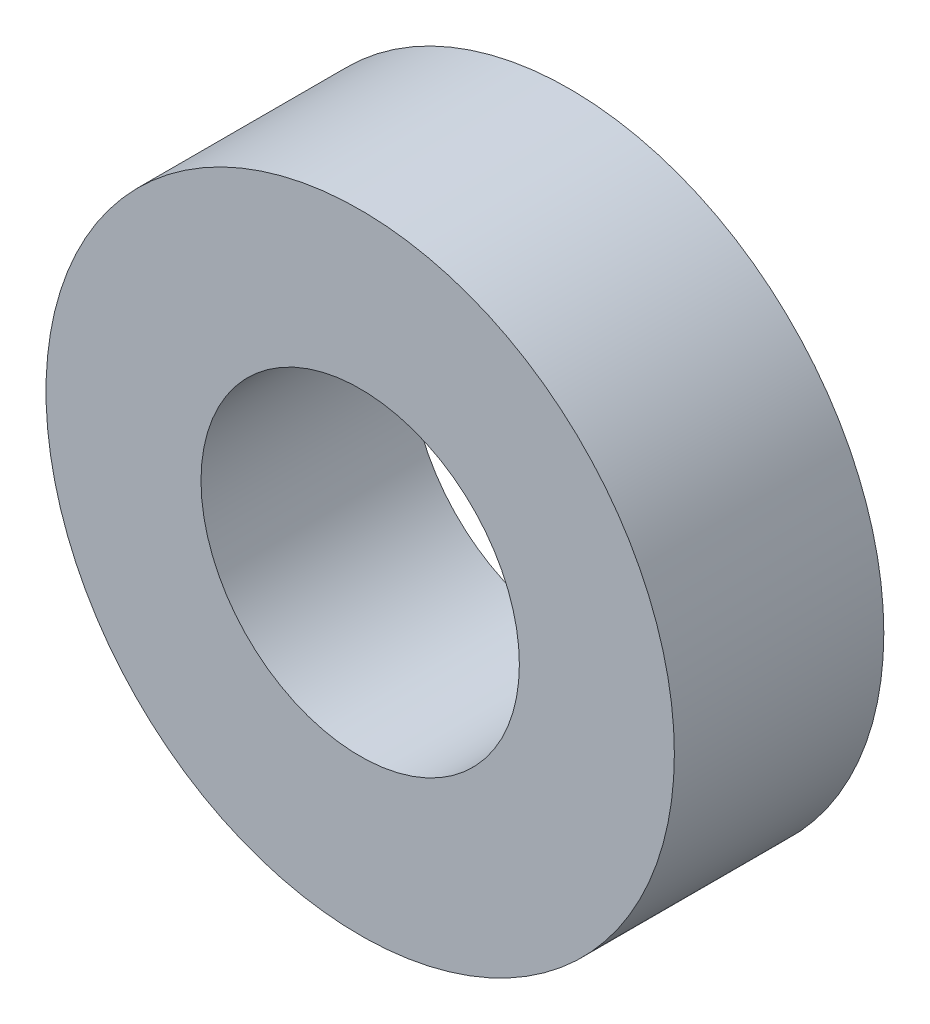
ISO-10303-21;
HEADER;
FILE_DESCRIPTION(('STEP AP214'),'2;1');
FILE_NAME('part.step','',(''),(''),'','','');
FILE_SCHEMA(('AUTOMOTIVE_DESIGN { 1 0 10303 214 1 1 1 1 }'));
ENDSEC;
DATA;
#1=APPLICATION_CONTEXT('core data for automotive mechanical design processes');
#2=APPLICATION_PROTOCOL_DEFINITION('international standard','automotive_design',2000,#1);
#3=PRODUCT_CONTEXT('',#1,'mechanical');
#4=PRODUCT('Part','Part','',(#3));
#5=PRODUCT_RELATED_PRODUCT_CATEGORY('part','',(#4));
#6=PRODUCT_DEFINITION_FORMATION('','',#4);
#7=PRODUCT_DEFINITION_CONTEXT('part definition',#1,'design');
#8=PRODUCT_DEFINITION('design','',#6,#7);
#9=PRODUCT_DEFINITION_SHAPE('','',#8);
#10=(LENGTH_UNIT() NAMED_UNIT(*) SI_UNIT(.MILLI.,.METRE.));
#11=(NAMED_UNIT(*) PLANE_ANGLE_UNIT() SI_UNIT($,.RADIAN.));
#12=(NAMED_UNIT(*) SI_UNIT($,.STERADIAN.) SOLID_ANGLE_UNIT());
#13=UNCERTAINTY_MEASURE_WITH_UNIT(LENGTH_MEASURE(1.E-05),#10,'distance_accuracy_value','');
#14=(GEOMETRIC_REPRESENTATION_CONTEXT(3) GLOBAL_UNCERTAINTY_ASSIGNED_CONTEXT((#13)) GLOBAL_UNIT_ASSIGNED_CONTEXT((#10,
#11,#12)) REPRESENTATION_CONTEXT('',''));
#15=CARTESIAN_POINT('',(0.,0.,0.));
#16=DIRECTION('',(0.,0.,1.));
#17=DIRECTION('',(1.,0.,0.));
#18=AXIS2_PLACEMENT_3D('',#15,#16,#17);
#19=CARTESIAN_POINT('',(0.,0.,3.175));
#20=DIRECTION('',(0.,0.,1.));
#21=DIRECTION('',(1.,0.,0.));
#22=AXIS2_PLACEMENT_3D('',#19,#20,#21);
#23=PLANE('',#22);
#24=CARTESIAN_POINT('',(0.,0.,3.175));
#25=DIRECTION('',(0.,0.,1.));
#26=DIRECTION('',(1.,0.,0.));
#27=AXIS2_PLACEMENT_3D('',#24,#25,#26);
#28=CIRCLE('',#27,9.525);
#29=CARTESIAN_POINT('',(9.525,0.,3.175));
#30=VERTEX_POINT('',#29);
#31=EDGE_CURVE('E10',#30,#30,#28,.T.);
#32=ORIENTED_EDGE('',*,*,#31,.T.);
#33=EDGE_LOOP('',(#32));
#34=FACE_BOUND('',#33,.T.);
#35=CARTESIAN_POINT('',(0.,0.,3.175));
#36=DIRECTION('',(0.,0.,1.));
#37=DIRECTION('',(1.,0.,0.));
#38=AXIS2_PLACEMENT_3D('',#35,#36,#37);
#39=CIRCLE('',#38,4.826);
#40=CARTESIAN_POINT('',(4.826,0.,3.175));
#41=VERTEX_POINT('',#40);
#42=EDGE_CURVE('E41',#41,#41,#39,.T.);
#43=ORIENTED_EDGE('',*,*,#42,.F.);
#44=EDGE_LOOP('',(#43));
#45=FACE_BOUND('',#44,.T.);
#46=ADVANCED_FACE('F30',(#34,#45),#23,.T.);
#47=CARTESIAN_POINT('',(0.,0.,-3.175));
#48=DIRECTION('',(0.,0.,1.));
#49=DIRECTION('',(1.,0.,0.));
#50=AXIS2_PLACEMENT_3D('',#47,#48,#49);
#51=PLANE('',#50);
#52=CARTESIAN_POINT('',(0.,0.,-3.175));
#53=DIRECTION('',(0.,0.,1.));
#54=DIRECTION('',(1.,0.,0.));
#55=AXIS2_PLACEMENT_3D('',#52,#53,#54);
#56=CIRCLE('',#55,9.525);
#57=CARTESIAN_POINT('',(9.525,0.,-3.175));
#58=VERTEX_POINT('',#57);
#59=EDGE_CURVE('E34',#58,#58,#56,.T.);
#60=ORIENTED_EDGE('',*,*,#59,.F.);
#61=EDGE_LOOP('',(#60));
#62=FACE_BOUND('',#61,.T.);
#63=CARTESIAN_POINT('',(0.,0.,-3.175));
#64=DIRECTION('',(0.,0.,1.));
#65=DIRECTION('',(1.,0.,0.));
#66=AXIS2_PLACEMENT_3D('',#63,#64,#65);
#67=CIRCLE('',#66,4.826);
#68=CARTESIAN_POINT('',(4.826,0.,-3.175));
#69=VERTEX_POINT('',#68);
#70=EDGE_CURVE('E43',#69,#69,#67,.T.);
#71=ORIENTED_EDGE('',*,*,#70,.T.);
#72=EDGE_LOOP('',(#71));
#73=FACE_BOUND('',#72,.T.);
#74=ADVANCED_FACE('F53',(#62,#73),#51,.F.);
#75=CARTESIAN_POINT('',(0.,0.,3.175));
#76=DIRECTION('',(0.,0.,-1.));
#77=DIRECTION('',(-1.,0.,0.));
#78=AXIS2_PLACEMENT_3D('',#75,#76,#77);
#79=CYLINDRICAL_SURFACE('',#78,9.525);
#80=ORIENTED_EDGE('',*,*,#31,.F.);
#81=EDGE_LOOP('',(#80));
#82=FACE_BOUND('',#81,.T.);
#83=ORIENTED_EDGE('',*,*,#59,.T.);
#84=EDGE_LOOP('',(#83));
#85=FACE_BOUND('',#84,.T.);
#86=ADVANCED_FACE('F32',(#82,#85),#79,.T.);
#87=CARTESIAN_POINT('',(0.,0.,3.175));
#88=DIRECTION('',(0.,0.,-1.));
#89=DIRECTION('',(-1.,0.,0.));
#90=AXIS2_PLACEMENT_3D('',#87,#88,#89);
#91=CYLINDRICAL_SURFACE('',#90,4.826);
#92=ORIENTED_EDGE('',*,*,#42,.T.);
#93=EDGE_LOOP('',(#92));
#94=FACE_BOUND('',#93,.T.);
#95=ORIENTED_EDGE('',*,*,#70,.F.);
#96=EDGE_LOOP('',(#95));
#97=FACE_BOUND('',#96,.T.);
#98=ADVANCED_FACE('F49',(#94,#97),#91,.F.);
#99=CLOSED_SHELL('',(#46,#74,#86,#98));
#100=MANIFOLD_SOLID_BREP('B2',#99);
#101=ADVANCED_BREP_SHAPE_REPRESENTATION('',(#18,#100),#14);
#102=SHAPE_DEFINITION_REPRESENTATION(#9,#101);
ENDSEC;
END-ISO-10303-21;
